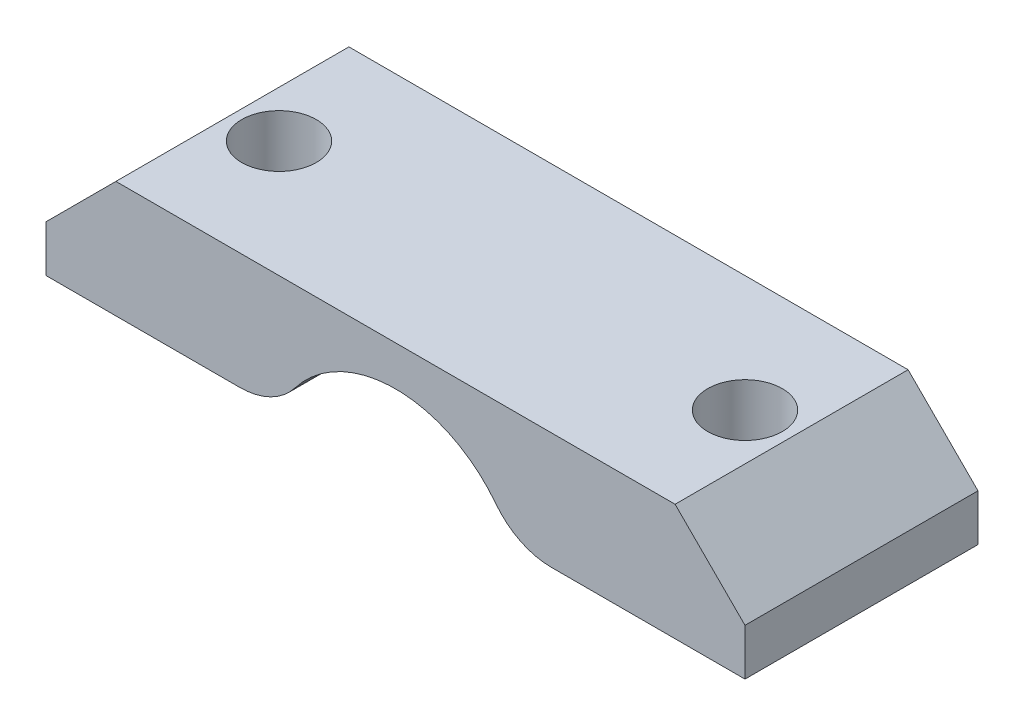
ISO-10303-21;
HEADER;
FILE_DESCRIPTION(('STEP AP214'),'2;1');
FILE_NAME('part.step','',(''),(''),'','','');
FILE_SCHEMA(('AUTOMOTIVE_DESIGN { 1 0 10303 214 1 1 1 1 }'));
ENDSEC;
DATA;
#1=APPLICATION_CONTEXT('core data for automotive mechanical design processes');
#2=APPLICATION_PROTOCOL_DEFINITION('international standard','automotive_design',2000,#1);
#3=PRODUCT_CONTEXT('',#1,'mechanical');
#4=PRODUCT('Part','Part','',(#3));
#5=PRODUCT_RELATED_PRODUCT_CATEGORY('part','',(#4));
#6=PRODUCT_DEFINITION_FORMATION('','',#4);
#7=PRODUCT_DEFINITION_CONTEXT('part definition',#1,'design');
#8=PRODUCT_DEFINITION('design','',#6,#7);
#9=PRODUCT_DEFINITION_SHAPE('','',#8);
#10=(LENGTH_UNIT() NAMED_UNIT(*) SI_UNIT(.MILLI.,.METRE.));
#11=(NAMED_UNIT(*) PLANE_ANGLE_UNIT() SI_UNIT($,.RADIAN.));
#12=(NAMED_UNIT(*) SI_UNIT($,.STERADIAN.) SOLID_ANGLE_UNIT());
#13=UNCERTAINTY_MEASURE_WITH_UNIT(LENGTH_MEASURE(1.E-05),#10,'distance_accuracy_value','');
#14=(GEOMETRIC_REPRESENTATION_CONTEXT(3) GLOBAL_UNCERTAINTY_ASSIGNED_CONTEXT((#13)) GLOBAL_UNIT_ASSIGNED_CONTEXT((#10,
#11,#12)) REPRESENTATION_CONTEXT('',''));
#15=CARTESIAN_POINT('',(0.,0.,0.));
#16=DIRECTION('',(0.,0.,1.));
#17=DIRECTION('',(1.,0.,0.));
#18=AXIS2_PLACEMENT_3D('',#15,#16,#17);
#19=CARTESIAN_POINT('',(0.,0.,10.));
#20=DIRECTION('',(0.,1.,0.));
#21=DIRECTION('',(0.,0.,1.));
#22=AXIS2_PLACEMENT_3D('',#19,#20,#21);
#23=PLANE('',#22);
#24=CARTESIAN_POINT('',(5.,0.,5.));
#25=DIRECTION('',(0.,1.,0.));
#26=DIRECTION('',(0.,0.,1.));
#27=AXIS2_PLACEMENT_3D('',#24,#25,#26);
#28=CIRCLE('',#27,1.6);
#29=CARTESIAN_POINT('',(5.,0.,6.6));
#30=VERTEX_POINT('',#29);
#31=EDGE_CURVE('E149',#30,#30,#28,.T.);
#32=ORIENTED_EDGE('',*,*,#31,.T.);
#33=EDGE_LOOP('',(#32));
#34=FACE_BOUND('',#33,.T.);
#35=DIRECTION('',(1.,0.,0.));
#36=VECTOR('',#35,1.);
#37=CARTESIAN_POINT('',(0.,0.,0.));
#38=LINE('',#37,#36);
#39=CARTESIAN_POINT('',(0.,0.,0.));
#40=VERTEX_POINT('',#39);
#41=CARTESIAN_POINT('',(8.31134991004079,0.,0.));
#42=VERTEX_POINT('',#41);
#43=EDGE_CURVE('E146',#40,#42,#38,.T.);
#44=ORIENTED_EDGE('',*,*,#43,.T.);
#45=DIRECTION('',(0.,0.,-1.));
#46=VECTOR('',#45,1.);
#47=CARTESIAN_POINT('',(8.31134991004079,0.,10.));
#48=LINE('',#47,#46);
#49=CARTESIAN_POINT('',(8.31134991004079,0.,10.));
#50=VERTEX_POINT('',#49);
#51=EDGE_CURVE('E11',#42,#50,#48,.F.);
#52=ORIENTED_EDGE('',*,*,#51,.T.);
#53=DIRECTION('',(1.,0.,0.));
#54=VECTOR('',#53,1.);
#55=CARTESIAN_POINT('',(0.,0.,10.));
#56=LINE('',#55,#54);
#57=CARTESIAN_POINT('',(0.,0.,10.));
#58=VERTEX_POINT('',#57);
#59=EDGE_CURVE('E159',#58,#50,#56,.T.);
#60=ORIENTED_EDGE('',*,*,#59,.F.);
#61=DIRECTION('',(0.,0.,-1.));
#62=VECTOR('',#61,1.);
#63=CARTESIAN_POINT('',(0.,0.,10.));
#64=LINE('',#63,#62);
#65=EDGE_CURVE('E133',#58,#40,#64,.T.);
#66=ORIENTED_EDGE('',*,*,#65,.T.);
#67=EDGE_LOOP('',(#44,#52,#60,#66));
#68=FACE_BOUND('',#67,.T.);
#69=ADVANCED_FACE('F33',(#34,#68),#23,.F.);
#70=CARTESIAN_POINT('',(15.,-2.15493270551635,10.));
#71=DIRECTION('',(0.,0.,-1.));
#72=DIRECTION('',(-1.,0.,0.));
#73=AXIS2_PLACEMENT_3D('',#70,#71,#72);
#74=CYLINDRICAL_SURFACE('',#73,5.44460604316823);
#75=CARTESIAN_POINT('',(15.,-2.15493270551635,0.));
#76=DIRECTION('',(0.,0.,-1.));
#77=DIRECTION('',(-1.,0.,0.));
#78=AXIS2_PLACEMENT_3D('',#75,#76,#77);
#79=CIRCLE('',#78,5.44460604316823);
#80=CARTESIAN_POINT('',(10.6875353907254,1.16867737375857,0.));
#81=VERTEX_POINT('',#80);
#82=CARTESIAN_POINT('',(19.3124646092746,1.16867737375857,0.));
#83=VERTEX_POINT('',#82);
#84=EDGE_CURVE('E148',#81,#83,#79,.T.);
#85=ORIENTED_EDGE('',*,*,#84,.T.);
#86=DIRECTION('',(0.,0.,-1.));
#87=VECTOR('',#86,1.);
#88=CARTESIAN_POINT('',(19.3124646092746,1.16867737375858,10.));
#89=LINE('',#88,#87);
#90=CARTESIAN_POINT('',(19.3124646092746,1.16867737375857,10.));
#91=VERTEX_POINT('',#90);
#92=EDGE_CURVE('E54',#83,#91,#89,.F.);
#93=ORIENTED_EDGE('',*,*,#92,.T.);
#94=CARTESIAN_POINT('',(15.,-2.15493270551635,10.));
#95=DIRECTION('',(0.,0.,-1.));
#96=DIRECTION('',(-1.,0.,0.));
#97=AXIS2_PLACEMENT_3D('',#94,#95,#96);
#98=CIRCLE('',#97,5.44460604316823);
#99=CARTESIAN_POINT('',(10.6875353907254,1.16867737375857,10.));
#100=VERTEX_POINT('',#99);
#101=EDGE_CURVE('E122',#100,#91,#98,.T.);
#102=ORIENTED_EDGE('',*,*,#101,.F.);
#103=DIRECTION('',(0.,0.,-1.));
#104=VECTOR('',#103,1.);
#105=CARTESIAN_POINT('',(10.6875353907254,1.16867737375857,10.));
#106=LINE('',#105,#104);
#107=EDGE_CURVE('E184',#100,#81,#106,.T.);
#108=ORIENTED_EDGE('',*,*,#107,.T.);
#109=EDGE_LOOP('',(#85,#93,#102,#108));
#110=FACE_BOUND('',#109,.T.);
#111=ADVANCED_FACE('F192',(#110),#74,.F.);
#112=CARTESIAN_POINT('',(30.,0.,10.));
#113=DIRECTION('',(0.,1.,0.));
#114=DIRECTION('',(-1.,0.,0.));
#115=AXIS2_PLACEMENT_3D('',#112,#113,#114);
#116=PLANE('',#115);
#117=CARTESIAN_POINT('',(25.,0.,5.));
#118=DIRECTION('',(0.,1.,0.));
#119=DIRECTION('',(-1.,0.,0.));
#120=AXIS2_PLACEMENT_3D('',#117,#118,#119);
#121=CIRCLE('',#120,1.6);
#122=CARTESIAN_POINT('',(23.4,0.,5.));
#123=VERTEX_POINT('',#122);
#124=EDGE_CURVE('E264',#123,#123,#121,.T.);
#125=ORIENTED_EDGE('',*,*,#124,.T.);
#126=EDGE_LOOP('',(#125));
#127=FACE_BOUND('',#126,.T.);
#128=DIRECTION('',(1.,0.,0.));
#129=VECTOR('',#128,1.);
#130=CARTESIAN_POINT('',(30.,0.,10.));
#131=LINE('',#130,#129);
#132=CARTESIAN_POINT('',(21.6886500899592,0.,10.));
#133=VERTEX_POINT('',#132);
#134=CARTESIAN_POINT('',(30.,0.,10.));
#135=VERTEX_POINT('',#134);
#136=EDGE_CURVE('E112',#133,#135,#131,.T.);
#137=ORIENTED_EDGE('',*,*,#136,.F.);
#138=DIRECTION('',(0.,0.,-1.));
#139=VECTOR('',#138,1.);
#140=CARTESIAN_POINT('',(21.6886500899592,0.,10.));
#141=LINE('',#140,#139);
#142=CARTESIAN_POINT('',(21.6886500899592,0.,0.));
#143=VERTEX_POINT('',#142);
#144=EDGE_CURVE('E178',#133,#143,#141,.T.);
#145=ORIENTED_EDGE('',*,*,#144,.T.);
#146=DIRECTION('',(1.,0.,0.));
#147=VECTOR('',#146,1.);
#148=CARTESIAN_POINT('',(30.,0.,0.));
#149=LINE('',#148,#147);
#150=CARTESIAN_POINT('',(30.,0.,0.));
#151=VERTEX_POINT('',#150);
#152=EDGE_CURVE('E128',#143,#151,#149,.T.);
#153=ORIENTED_EDGE('',*,*,#152,.T.);
#154=DIRECTION('',(0.,0.,-1.));
#155=VECTOR('',#154,1.);
#156=CARTESIAN_POINT('',(30.,0.,10.));
#157=LINE('',#156,#155);
#158=EDGE_CURVE('E125',#135,#151,#157,.T.);
#159=ORIENTED_EDGE('',*,*,#158,.F.);
#160=EDGE_LOOP('',(#137,#145,#153,#159));
#161=FACE_BOUND('',#160,.T.);
#162=ADVANCED_FACE('F126',(#127,#161),#116,.F.);
#163=CARTESIAN_POINT('',(30.,5.,10.));
#164=DIRECTION('',(-1.,0.,0.));
#165=DIRECTION('',(0.,0.,1.));
#166=AXIS2_PLACEMENT_3D('',#163,#164,#165);
#167=PLANE('',#166);
#168=DIRECTION('',(0.,1.,0.));
#169=VECTOR('',#168,1.);
#170=CARTESIAN_POINT('',(30.,5.,0.));
#171=LINE('',#170,#169);
#172=CARTESIAN_POINT('',(30.,1.99999999999999,0.));
#173=VERTEX_POINT('',#172);
#174=EDGE_CURVE('E152',#151,#173,#171,.T.);
#175=ORIENTED_EDGE('',*,*,#174,.T.);
#176=DIRECTION('',(0.,0.,1.));
#177=VECTOR('',#176,1.);
#178=CARTESIAN_POINT('',(30.,1.99999999999999,10.));
#179=LINE('',#178,#177);
#180=CARTESIAN_POINT('',(30.,1.99999999999999,10.));
#181=VERTEX_POINT('',#180);
#182=EDGE_CURVE('E137',#173,#181,#179,.T.);
#183=ORIENTED_EDGE('',*,*,#182,.T.);
#184=DIRECTION('',(0.,1.,0.));
#185=VECTOR('',#184,1.);
#186=CARTESIAN_POINT('',(30.,5.,10.));
#187=LINE('',#186,#185);
#188=EDGE_CURVE('E116',#135,#181,#187,.T.);
#189=ORIENTED_EDGE('',*,*,#188,.F.);
#190=ORIENTED_EDGE('',*,*,#158,.T.);
#191=EDGE_LOOP('',(#175,#183,#189,#190));
#192=FACE_BOUND('',#191,.T.);
#193=ADVANCED_FACE('F135',(#192),#167,.F.);
#194=CARTESIAN_POINT('',(0.,5.,10.));
#195=DIRECTION('',(0.,-1.,0.));
#196=DIRECTION('',(0.,0.,-1.));
#197=AXIS2_PLACEMENT_3D('',#194,#195,#196);
#198=PLANE('',#197);
#199=CARTESIAN_POINT('',(25.,5.,5.));
#200=DIRECTION('',(0.,1.,0.));
#201=DIRECTION('',(0.,0.,1.));
#202=AXIS2_PLACEMENT_3D('',#199,#200,#201);
#203=CIRCLE('',#202,1.6);
#204=CARTESIAN_POINT('',(25.,5.,6.6));
#205=VERTEX_POINT('',#204);
#206=EDGE_CURVE('E266',#205,#205,#203,.T.);
#207=ORIENTED_EDGE('',*,*,#206,.F.);
#208=EDGE_LOOP('',(#207));
#209=FACE_BOUND('',#208,.T.);
#210=CARTESIAN_POINT('',(5.,5.,5.));
#211=DIRECTION('',(0.,1.,0.));
#212=DIRECTION('',(0.,0.,1.));
#213=AXIS2_PLACEMENT_3D('',#210,#211,#212);
#214=CIRCLE('',#213,1.6);
#215=CARTESIAN_POINT('',(5.,5.,6.6));
#216=VERTEX_POINT('',#215);
#217=EDGE_CURVE('E265',#216,#216,#214,.T.);
#218=ORIENTED_EDGE('',*,*,#217,.F.);
#219=EDGE_LOOP('',(#218));
#220=FACE_BOUND('',#219,.T.);
#221=DIRECTION('',(-1.,0.,0.));
#222=VECTOR('',#221,1.);
#223=CARTESIAN_POINT('',(0.,5.,10.));
#224=LINE('',#223,#222);
#225=CARTESIAN_POINT('',(27.,5.,10.));
#226=VERTEX_POINT('',#225);
#227=CARTESIAN_POINT('',(3.00000000000001,5.,10.));
#228=VERTEX_POINT('',#227);
#229=EDGE_CURVE('E138',#226,#228,#224,.T.);
#230=ORIENTED_EDGE('',*,*,#229,.F.);
#231=DIRECTION('',(0.,0.,-1.));
#232=VECTOR('',#231,1.);
#233=CARTESIAN_POINT('',(27.,5.,10.));
#234=LINE('',#233,#232);
#235=CARTESIAN_POINT('',(27.,5.,0.));
#236=VERTEX_POINT('',#235);
#237=EDGE_CURVE('E163',#226,#236,#234,.T.);
#238=ORIENTED_EDGE('',*,*,#237,.T.);
#239=DIRECTION('',(-1.,0.,0.));
#240=VECTOR('',#239,1.);
#241=CARTESIAN_POINT('',(0.,5.,0.));
#242=LINE('',#241,#240);
#243=CARTESIAN_POINT('',(3.00000000000001,5.,0.));
#244=VERTEX_POINT('',#243);
#245=EDGE_CURVE('E154',#236,#244,#242,.T.);
#246=ORIENTED_EDGE('',*,*,#245,.T.);
#247=DIRECTION('',(0.,0.,1.));
#248=VECTOR('',#247,1.);
#249=CARTESIAN_POINT('',(3.00000000000001,5.,10.));
#250=LINE('',#249,#248);
#251=EDGE_CURVE('E132',#244,#228,#250,.T.);
#252=ORIENTED_EDGE('',*,*,#251,.T.);
#253=EDGE_LOOP('',(#230,#238,#246,#252));
#254=FACE_BOUND('',#253,.T.);
#255=ADVANCED_FACE('F208',(#209,#220,#254),#198,.F.);
#256=CARTESIAN_POINT('',(0.,0.,10.));
#257=DIRECTION('',(1.,0.,0.));
#258=DIRECTION('',(0.,0.,-1.));
#259=AXIS2_PLACEMENT_3D('',#256,#257,#258);
#260=PLANE('',#259);
#261=DIRECTION('',(0.,-1.,0.));
#262=VECTOR('',#261,1.);
#263=CARTESIAN_POINT('',(0.,0.,10.));
#264=LINE('',#263,#262);
#265=CARTESIAN_POINT('',(0.,2.,10.));
#266=VERTEX_POINT('',#265);
#267=EDGE_CURVE('E141',#266,#58,#264,.T.);
#268=ORIENTED_EDGE('',*,*,#267,.F.);
#269=DIRECTION('',(0.,0.,-1.));
#270=VECTOR('',#269,1.);
#271=CARTESIAN_POINT('',(0.,2.,10.));
#272=LINE('',#271,#270);
#273=CARTESIAN_POINT('',(0.,2.,0.));
#274=VERTEX_POINT('',#273);
#275=EDGE_CURVE('E175',#266,#274,#272,.T.);
#276=ORIENTED_EDGE('',*,*,#275,.T.);
#277=DIRECTION('',(0.,-1.,0.));
#278=VECTOR('',#277,1.);
#279=CARTESIAN_POINT('',(0.,0.,0.));
#280=LINE('',#279,#278);
#281=EDGE_CURVE('E157',#274,#40,#280,.T.);
#282=ORIENTED_EDGE('',*,*,#281,.T.);
#283=ORIENTED_EDGE('',*,*,#65,.F.);
#284=EDGE_LOOP('',(#268,#276,#282,#283));
#285=FACE_BOUND('',#284,.T.);
#286=ADVANCED_FACE('F201',(#285),#260,.F.);
#287=CARTESIAN_POINT('',(15.,-2.15493270551635,10.));
#288=DIRECTION('',(0.,0.,-1.));
#289=DIRECTION('',(-1.,0.,0.));
#290=AXIS2_PLACEMENT_3D('',#287,#288,#289);
#291=PLANE('',#290);
#292=ORIENTED_EDGE('',*,*,#101,.T.);
#293=CARTESIAN_POINT('',(21.6886500899592,3.,10.));
#294=DIRECTION('',(0.,0.,-1.));
#295=DIRECTION('',(-1.,0.,0.));
#296=AXIS2_PLACEMENT_3D('',#293,#294,#295);
#297=CIRCLE('',#296,3.);
#298=EDGE_CURVE('E41',#91,#133,#297,.F.);
#299=ORIENTED_EDGE('',*,*,#298,.T.);
#300=ORIENTED_EDGE('',*,*,#136,.T.);
#301=ORIENTED_EDGE('',*,*,#188,.T.);
#302=DIRECTION('',(0.707106781186546,-0.707106781186549,0.));
#303=VECTOR('',#302,1.);
#304=CARTESIAN_POINT('',(27.,5.,10.));
#305=LINE('',#304,#303);
#306=EDGE_CURVE('E173',#181,#226,#305,.F.);
#307=ORIENTED_EDGE('',*,*,#306,.T.);
#308=ORIENTED_EDGE('',*,*,#229,.T.);
#309=DIRECTION('',(0.707106781186549,0.707106781186546,0.));
#310=VECTOR('',#309,1.);
#311=CARTESIAN_POINT('',(0.,2.,10.));
#312=LINE('',#311,#310);
#313=EDGE_CURVE('E171',#228,#266,#312,.F.);
#314=ORIENTED_EDGE('',*,*,#313,.T.);
#315=ORIENTED_EDGE('',*,*,#267,.T.);
#316=ORIENTED_EDGE('',*,*,#59,.T.);
#317=CARTESIAN_POINT('',(8.31134991004079,3.,10.));
#318=DIRECTION('',(0.,0.,-1.));
#319=DIRECTION('',(-1.,0.,0.));
#320=AXIS2_PLACEMENT_3D('',#317,#318,#319);
#321=CIRCLE('',#320,3.);
#322=EDGE_CURVE('E188',#50,#100,#321,.F.);
#323=ORIENTED_EDGE('',*,*,#322,.T.);
#324=EDGE_LOOP('',(#292,#299,#300,#301,#307,#308,#314,#315,#316,#323));
#325=FACE_BOUND('',#324,.T.);
#326=ADVANCED_FACE('F114',(#325),#291,.F.);
#327=CARTESIAN_POINT('',(15.,-2.15493270551635,0.));
#328=DIRECTION('',(0.,0.,-1.));
#329=DIRECTION('',(-1.,0.,0.));
#330=AXIS2_PLACEMENT_3D('',#327,#328,#329);
#331=PLANE('',#330);
#332=ORIENTED_EDGE('',*,*,#152,.F.);
#333=CARTESIAN_POINT('',(21.6886500899592,3.,0.));
#334=DIRECTION('',(0.,0.,-1.));
#335=DIRECTION('',(-1.,0.,0.));
#336=AXIS2_PLACEMENT_3D('',#333,#334,#335);
#337=CIRCLE('',#336,3.);
#338=EDGE_CURVE('E182',#143,#83,#337,.T.);
#339=ORIENTED_EDGE('',*,*,#338,.T.);
#340=ORIENTED_EDGE('',*,*,#84,.F.);
#341=CARTESIAN_POINT('',(8.31134991004079,3.,0.));
#342=DIRECTION('',(0.,0.,-1.));
#343=DIRECTION('',(-1.,0.,0.));
#344=AXIS2_PLACEMENT_3D('',#341,#342,#343);
#345=CIRCLE('',#344,3.);
#346=EDGE_CURVE('E180',#81,#42,#345,.T.);
#347=ORIENTED_EDGE('',*,*,#346,.T.);
#348=ORIENTED_EDGE('',*,*,#43,.F.);
#349=ORIENTED_EDGE('',*,*,#281,.F.);
#350=DIRECTION('',(-0.707106781186549,-0.707106781186546,0.));
#351=VECTOR('',#350,1.);
#352=CARTESIAN_POINT('',(5.42253364724185,7.42253364724183,0.));
#353=LINE('',#352,#351);
#354=EDGE_CURVE('E166',#274,#244,#353,.F.);
#355=ORIENTED_EDGE('',*,*,#354,.T.);
#356=ORIENTED_EDGE('',*,*,#245,.F.);
#357=DIRECTION('',(-0.707106781186546,0.707106781186549,0.));
#358=VECTOR('',#357,1.);
#359=CARTESIAN_POINT('',(24.5774663527582,7.42253364724181,0.));
#360=LINE('',#359,#358);
#361=EDGE_CURVE('E168',#236,#173,#360,.F.);
#362=ORIENTED_EDGE('',*,*,#361,.T.);
#363=ORIENTED_EDGE('',*,*,#174,.F.);
#364=EDGE_LOOP('',(#332,#339,#340,#347,#348,#349,#355,#356,#362,#363));
#365=FACE_BOUND('',#364,.T.);
#366=ADVANCED_FACE('F196',(#365),#331,.T.);
#367=CARTESIAN_POINT('',(5.,-5.,5.));
#368=DIRECTION('',(0.,1.,0.));
#369=DIRECTION('',(0.,0.,1.));
#370=AXIS2_PLACEMENT_3D('',#367,#368,#369);
#371=CYLINDRICAL_SURFACE('',#370,1.6);
#372=ORIENTED_EDGE('',*,*,#217,.T.);
#373=EDGE_LOOP('',(#372));
#374=FACE_BOUND('',#373,.T.);
#375=ORIENTED_EDGE('',*,*,#31,.F.);
#376=EDGE_LOOP('',(#375));
#377=FACE_BOUND('',#376,.T.);
#378=ADVANCED_FACE('F237',(#374,#377),#371,.F.);
#379=CARTESIAN_POINT('',(25.,-5.,5.));
#380=DIRECTION('',(0.,1.,0.));
#381=DIRECTION('',(0.,0.,1.));
#382=AXIS2_PLACEMENT_3D('',#379,#380,#381);
#383=CYLINDRICAL_SURFACE('',#382,1.6);
#384=ORIENTED_EDGE('',*,*,#206,.T.);
#385=EDGE_LOOP('',(#384));
#386=FACE_BOUND('',#385,.T.);
#387=ORIENTED_EDGE('',*,*,#124,.F.);
#388=EDGE_LOOP('',(#387));
#389=FACE_BOUND('',#388,.T.);
#390=ADVANCED_FACE('F233',(#386,#389),#383,.F.);
#391=CARTESIAN_POINT('',(27.,5.,10.));
#392=DIRECTION('',(-0.707106781186549,-0.707106781186546,0.));
#393=DIRECTION('',(0.,0.,-1.));
#394=AXIS2_PLACEMENT_3D('',#391,#392,#393);
#395=PLANE('',#394);
#396=ORIENTED_EDGE('',*,*,#306,.F.);
#397=ORIENTED_EDGE('',*,*,#182,.F.);
#398=ORIENTED_EDGE('',*,*,#361,.F.);
#399=ORIENTED_EDGE('',*,*,#237,.F.);
#400=EDGE_LOOP('',(#396,#397,#398,#399));
#401=FACE_BOUND('',#400,.T.);
#402=ADVANCED_FACE('F213',(#401),#395,.F.);
#403=CARTESIAN_POINT('',(0.,2.,10.));
#404=DIRECTION('',(0.707106781186546,-0.707106781186549,0.));
#405=DIRECTION('',(0.,0.,-1.));
#406=AXIS2_PLACEMENT_3D('',#403,#404,#405);
#407=PLANE('',#406);
#408=ORIENTED_EDGE('',*,*,#313,.F.);
#409=ORIENTED_EDGE('',*,*,#251,.F.);
#410=ORIENTED_EDGE('',*,*,#354,.F.);
#411=ORIENTED_EDGE('',*,*,#275,.F.);
#412=EDGE_LOOP('',(#408,#409,#410,#411));
#413=FACE_BOUND('',#412,.T.);
#414=ADVANCED_FACE('F211',(#413),#407,.F.);
#415=CARTESIAN_POINT('',(21.6886500899592,3.,10.));
#416=DIRECTION('',(0.,0.,-1.));
#417=DIRECTION('',(-1.,0.,0.));
#418=AXIS2_PLACEMENT_3D('',#415,#416,#417);
#419=CYLINDRICAL_SURFACE('',#418,3.);
#420=ORIENTED_EDGE('',*,*,#298,.F.);
#421=ORIENTED_EDGE('',*,*,#92,.F.);
#422=ORIENTED_EDGE('',*,*,#338,.F.);
#423=ORIENTED_EDGE('',*,*,#144,.F.);
#424=EDGE_LOOP('',(#420,#421,#422,#423));
#425=FACE_BOUND('',#424,.T.);
#426=ADVANCED_FACE('F215',(#425),#419,.T.);
#427=CARTESIAN_POINT('',(8.31134991004079,3.,10.));
#428=DIRECTION('',(0.,0.,-1.));
#429=DIRECTION('',(-1.,0.,0.));
#430=AXIS2_PLACEMENT_3D('',#427,#428,#429);
#431=CYLINDRICAL_SURFACE('',#430,3.);
#432=ORIENTED_EDGE('',*,*,#322,.F.);
#433=ORIENTED_EDGE('',*,*,#51,.F.);
#434=ORIENTED_EDGE('',*,*,#346,.F.);
#435=ORIENTED_EDGE('',*,*,#107,.F.);
#436=EDGE_LOOP('',(#432,#433,#434,#435));
#437=FACE_BOUND('',#436,.T.);
#438=ADVANCED_FACE('F35',(#437),#431,.T.);
#439=CLOSED_SHELL('',(#69,#111,#162,#193,#255,#286,#326,#366,#378,#390,#402,#414,#426,#438));
#440=MANIFOLD_SOLID_BREP('B2',#439);
#441=ADVANCED_BREP_SHAPE_REPRESENTATION('',(#18,#440),#14);
#442=SHAPE_DEFINITION_REPRESENTATION(#9,#441);
ENDSEC;
END-ISO-10303-21;
